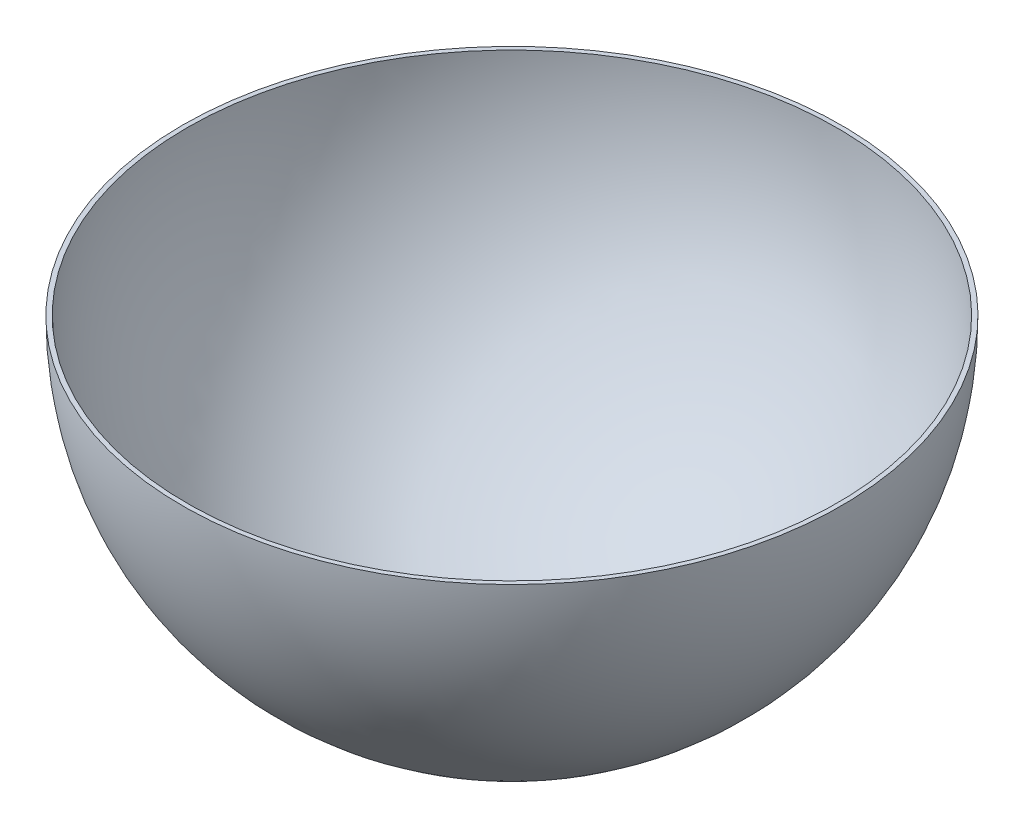
ISO-10303-21;
HEADER;
FILE_DESCRIPTION(('STEP AP214'),'2;1');
FILE_NAME('part.step','',(''),(''),'','','');
FILE_SCHEMA(('AUTOMOTIVE_DESIGN { 1 0 10303 214 1 1 1 1 }'));
ENDSEC;
DATA;
#1=APPLICATION_CONTEXT('core data for automotive mechanical design processes');
#2=APPLICATION_PROTOCOL_DEFINITION('international standard','automotive_design',2000,#1);
#3=PRODUCT_CONTEXT('',#1,'mechanical');
#4=PRODUCT('Part','Part','',(#3));
#5=PRODUCT_RELATED_PRODUCT_CATEGORY('part','',(#4));
#6=PRODUCT_DEFINITION_FORMATION('','',#4);
#7=PRODUCT_DEFINITION_CONTEXT('part definition',#1,'design');
#8=PRODUCT_DEFINITION('design','',#6,#7);
#9=PRODUCT_DEFINITION_SHAPE('','',#8);
#10=(LENGTH_UNIT() NAMED_UNIT(*) SI_UNIT(.MILLI.,.METRE.));
#11=(NAMED_UNIT(*) PLANE_ANGLE_UNIT() SI_UNIT($,.RADIAN.));
#12=(NAMED_UNIT(*) SI_UNIT($,.STERADIAN.) SOLID_ANGLE_UNIT());
#13=UNCERTAINTY_MEASURE_WITH_UNIT(LENGTH_MEASURE(1.E-05),#10,'distance_accuracy_value','');
#14=(GEOMETRIC_REPRESENTATION_CONTEXT(3) GLOBAL_UNCERTAINTY_ASSIGNED_CONTEXT((#13)) GLOBAL_UNIT_ASSIGNED_CONTEXT((#10,
#11,#12)) REPRESENTATION_CONTEXT('',''));
#15=CARTESIAN_POINT('',(0.,0.,0.));
#16=DIRECTION('',(0.,0.,1.));
#17=DIRECTION('',(1.,0.,0.));
#18=AXIS2_PLACEMENT_3D('',#15,#16,#17);
#19=CARTESIAN_POINT('',(0.,0.,0.));
#20=DIRECTION('',(0.,1.,0.));
#21=DIRECTION('',(-1.,0.,0.));
#22=AXIS2_PLACEMENT_3D('',#19,#20,#21);
#23=SPHERICAL_SURFACE('',#22,294.386);
#24=CARTESIAN_POINT('',(0.,0.,0.));
#25=DIRECTION('',(0.,1.,0.));
#26=DIRECTION('',(-1.,0.,0.));
#27=AXIS2_PLACEMENT_3D('',#24,#25,#26);
#28=CIRCLE('',#27,294.386);
#29=CARTESIAN_POINT('',(-294.386,0.,0.));
#30=VERTEX_POINT('',#29);
#31=EDGE_CURVE('E10',#30,#30,#28,.T.);
#32=ORIENTED_EDGE('',*,*,#31,.T.);
#33=EDGE_LOOP('',(#32));
#34=FACE_BOUND('',#33,.T.);
#35=CARTESIAN_POINT('',(-6.10622663543836E-13,-294.383781052897,-1.0547118733939E-12));
#36=DIRECTION('',(0.,1.,0.));
#37=DIRECTION('',(0.,0.,1.));
#38=AXIS2_PLACEMENT_3D('',#35,#36,#37);
#39=CIRCLE('',#38,1.14300000000008);
#40=CARTESIAN_POINT('',(-6.10622663543836E-13,-294.383781052897,1.14299999999903));
#41=VERTEX_POINT('',#40);
#42=EDGE_CURVE('E43',#41,#41,#39,.T.);
#43=ORIENTED_EDGE('',*,*,#42,.F.);
#44=EDGE_LOOP('',(#43));
#45=FACE_BOUND('',#44,.T.);
#46=ADVANCED_FACE('F32',(#34,#45),#23,.F.);
#47=CARTESIAN_POINT('',(0.,0.,0.));
#48=DIRECTION('',(0.,1.,0.));
#49=DIRECTION('',(-1.,0.,0.));
#50=AXIS2_PLACEMENT_3D('',#47,#48,#49);
#51=SPHERICAL_SURFACE('',#50,298.45);
#52=CARTESIAN_POINT('',(0.,0.,0.));
#53=DIRECTION('',(0.,1.,0.));
#54=DIRECTION('',(-1.,0.,0.));
#55=AXIS2_PLACEMENT_3D('',#52,#53,#54);
#56=CIRCLE('',#55,298.45);
#57=CARTESIAN_POINT('',(-298.45,0.,0.));
#58=VERTEX_POINT('',#57);
#59=EDGE_CURVE('E39',#58,#58,#56,.T.);
#60=ORIENTED_EDGE('',*,*,#59,.F.);
#61=EDGE_LOOP('',(#60));
#62=FACE_BOUND('',#61,.T.);
#63=CARTESIAN_POINT('',(-6.10622663543836E-13,-298.44781126857,-1.0547118733939E-12));
#64=DIRECTION('',(0.,1.,0.));
#65=DIRECTION('',(0.,0.,1.));
#66=AXIS2_PLACEMENT_3D('',#63,#64,#65);
#67=CIRCLE('',#66,1.14300000000008);
#68=CARTESIAN_POINT('',(-6.10622663543836E-13,-298.44781126857,1.14299999999903));
#69=VERTEX_POINT('',#68);
#70=EDGE_CURVE('E35',#69,#69,#67,.T.);
#71=ORIENTED_EDGE('',*,*,#70,.T.);
#72=EDGE_LOOP('',(#71));
#73=FACE_BOUND('',#72,.T.);
#74=ADVANCED_FACE('F52',(#62,#73),#51,.T.);
#75=CARTESIAN_POINT('',(0.,0.,0.));
#76=DIRECTION('',(0.,1.,0.));
#77=DIRECTION('',(-1.,0.,0.));
#78=AXIS2_PLACEMENT_3D('',#75,#76,#77);
#79=PLANE('',#78);
#80=ORIENTED_EDGE('',*,*,#59,.T.);
#81=EDGE_LOOP('',(#80));
#82=FACE_BOUND('',#81,.T.);
#83=ORIENTED_EDGE('',*,*,#31,.F.);
#84=EDGE_LOOP('',(#83));
#85=FACE_BOUND('',#84,.T.);
#86=ADVANCED_FACE('F56',(#82,#85),#79,.T.);
#87=CARTESIAN_POINT('',(-6.10622663543836E-13,814.946463541958,-1.0547118733939E-12));
#88=DIRECTION('',(0.,-1.,0.));
#89=DIRECTION('',(0.,0.,-1.));
#90=AXIS2_PLACEMENT_3D('',#87,#88,#89);
#91=CYLINDRICAL_SURFACE('',#90,1.14300000000008);
#92=ORIENTED_EDGE('',*,*,#70,.F.);
#93=EDGE_LOOP('',(#92));
#94=FACE_BOUND('',#93,.T.);
#95=ORIENTED_EDGE('',*,*,#42,.T.);
#96=EDGE_LOOP('',(#95));
#97=FACE_BOUND('',#96,.T.);
#98=ADVANCED_FACE('F54',(#94,#97),#91,.F.);
#99=CLOSED_SHELL('',(#46,#74,#86,#98));
#100=MANIFOLD_SOLID_BREP('B2',#99);
#101=ADVANCED_BREP_SHAPE_REPRESENTATION('',(#18,#100),#14);
#102=SHAPE_DEFINITION_REPRESENTATION(#9,#101);
ENDSEC;
END-ISO-10303-21;
